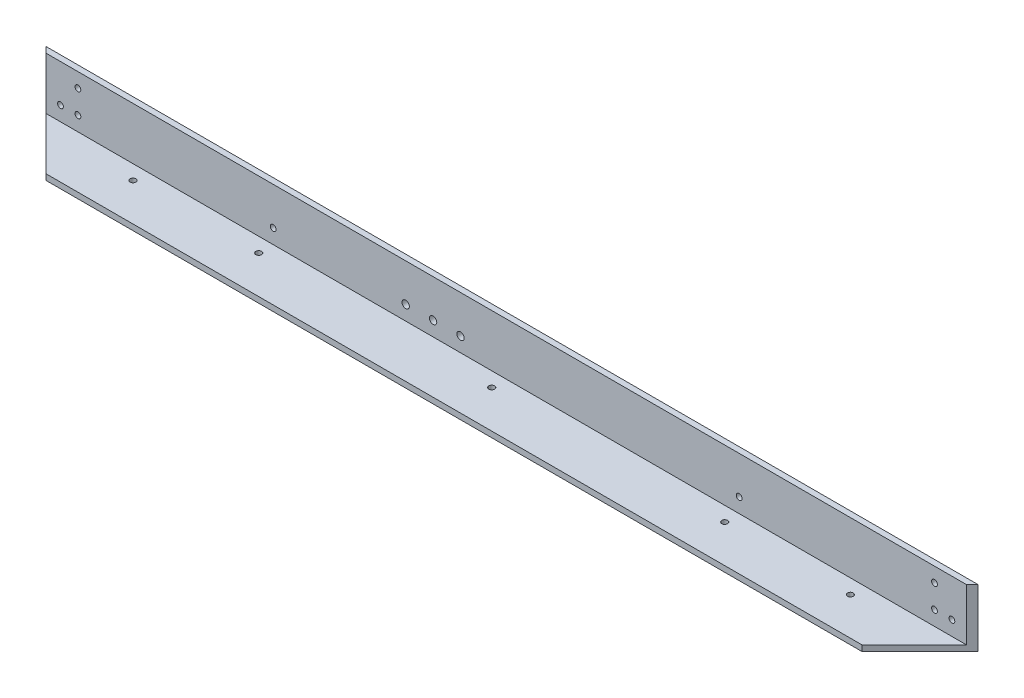
ISO-10303-21;
HEADER;
FILE_DESCRIPTION(('STEP AP214'),'2;1');
FILE_NAME('part.step','',(''),(''),'','','');
FILE_SCHEMA(('AUTOMOTIVE_DESIGN { 1 0 10303 214 1 1 1 1 }'));
ENDSEC;
DATA;
#1=APPLICATION_CONTEXT('core data for automotive mechanical design processes');
#2=APPLICATION_PROTOCOL_DEFINITION('international standard','automotive_design',2000,#1);
#3=PRODUCT_CONTEXT('',#1,'mechanical');
#4=PRODUCT('Part','Part','',(#3));
#5=PRODUCT_RELATED_PRODUCT_CATEGORY('part','',(#4));
#6=PRODUCT_DEFINITION_FORMATION('','',#4);
#7=PRODUCT_DEFINITION_CONTEXT('part definition',#1,'design');
#8=PRODUCT_DEFINITION('design','',#6,#7);
#9=PRODUCT_DEFINITION_SHAPE('','',#8);
#10=(LENGTH_UNIT() NAMED_UNIT(*) SI_UNIT(.MILLI.,.METRE.));
#11=(NAMED_UNIT(*) PLANE_ANGLE_UNIT() SI_UNIT($,.RADIAN.));
#12=(NAMED_UNIT(*) SI_UNIT($,.STERADIAN.) SOLID_ANGLE_UNIT());
#13=UNCERTAINTY_MEASURE_WITH_UNIT(LENGTH_MEASURE(1.E-05),#10,'distance_accuracy_value','');
#14=(GEOMETRIC_REPRESENTATION_CONTEXT(3) GLOBAL_UNCERTAINTY_ASSIGNED_CONTEXT((#13)) GLOBAL_UNIT_ASSIGNED_CONTEXT((#10,
#11,#12)) REPRESENTATION_CONTEXT('',''));
#15=CARTESIAN_POINT('',(0.,0.,0.));
#16=DIRECTION('',(0.,0.,1.));
#17=DIRECTION('',(1.,0.,0.));
#18=AXIS2_PLACEMENT_3D('',#15,#16,#17);
#19=CARTESIAN_POINT('',(510.,31.75,0.));
#20=DIRECTION('',(0.,0.,1.));
#21=DIRECTION('',(0.,-1.,0.));
#22=AXIS2_PLACEMENT_3D('',#19,#20,#21);
#23=PLANE('',#22);
#24=CARTESIAN_POINT('',(498.8875,11.1125,0.));
#25=DIRECTION('',(0.,0.,1.));
#26=DIRECTION('',(1.,0.,0.));
#27=AXIS2_PLACEMENT_3D('',#24,#25,#26);
#28=CIRCLE('',#27,1.58749999999999);
#29=CARTESIAN_POINT('',(500.475,11.1125,0.));
#30=VERTEX_POINT('',#29);
#31=EDGE_CURVE('E291',#30,#30,#28,.T.);
#32=ORIENTED_EDGE('',*,*,#31,.T.);
#33=EDGE_LOOP('',(#32));
#34=FACE_BOUND('',#33,.T.);
#35=CARTESIAN_POINT('',(200.,11.1125,0.));
#36=DIRECTION('',(0.,0.,1.));
#37=DIRECTION('',(1.,0.,0.));
#38=AXIS2_PLACEMENT_3D('',#35,#36,#37);
#39=CIRCLE('',#38,2.);
#40=CARTESIAN_POINT('',(202.,11.1125,0.));
#41=VERTEX_POINT('',#40);
#42=EDGE_CURVE('E281',#41,#41,#39,.T.);
#43=ORIENTED_EDGE('',*,*,#42,.T.);
#44=EDGE_LOOP('',(#43));
#45=FACE_BOUND('',#44,.T.);
#46=CARTESIAN_POINT('',(215.,11.1125,0.));
#47=DIRECTION('',(0.,0.,1.));
#48=DIRECTION('',(1.,0.,0.));
#49=AXIS2_PLACEMENT_3D('',#46,#47,#48);
#50=CIRCLE('',#49,2.);
#51=CARTESIAN_POINT('',(217.,11.1125,0.));
#52=VERTEX_POINT('',#51);
#53=EDGE_CURVE('E282',#52,#52,#50,.T.);
#54=ORIENTED_EDGE('',*,*,#53,.T.);
#55=EDGE_LOOP('',(#54));
#56=FACE_BOUND('',#55,.T.);
#57=CARTESIAN_POINT('',(230.,11.1125,0.));
#58=DIRECTION('',(0.,0.,1.));
#59=DIRECTION('',(1.,0.,0.));
#60=AXIS2_PLACEMENT_3D('',#57,#58,#59);
#61=CIRCLE('',#60,2.);
#62=CARTESIAN_POINT('',(232.,11.1125,0.));
#63=VERTEX_POINT('',#62);
#64=EDGE_CURVE('E265',#63,#63,#61,.T.);
#65=ORIENTED_EDGE('',*,*,#64,.T.);
#66=EDGE_LOOP('',(#65));
#67=FACE_BOUND('',#66,.T.);
#68=CARTESIAN_POINT('',(20.6375,23.8125,0.));
#69=DIRECTION('',(0.,0.,1.));
#70=DIRECTION('',(1.,0.,0.));
#71=AXIS2_PLACEMENT_3D('',#68,#69,#70);
#72=CIRCLE('',#71,1.5875);
#73=CARTESIAN_POINT('',(22.225,23.8125,0.));
#74=VERTEX_POINT('',#73);
#75=EDGE_CURVE('E314',#74,#74,#72,.T.);
#76=ORIENTED_EDGE('',*,*,#75,.T.);
#77=EDGE_LOOP('',(#76));
#78=FACE_BOUND('',#77,.T.);
#79=CARTESIAN_POINT('',(11.1125,11.1125,0.));
#80=DIRECTION('',(0.,0.,1.));
#81=DIRECTION('',(1.,0.,0.));
#82=AXIS2_PLACEMENT_3D('',#79,#80,#81);
#83=CIRCLE('',#82,1.5875);
#84=CARTESIAN_POINT('',(12.7,11.1125,0.));
#85=VERTEX_POINT('',#84);
#86=EDGE_CURVE('E301',#85,#85,#83,.T.);
#87=ORIENTED_EDGE('',*,*,#86,.T.);
#88=EDGE_LOOP('',(#87));
#89=FACE_BOUND('',#88,.T.);
#90=CARTESIAN_POINT('',(20.6375,11.1125,0.));
#91=DIRECTION('',(0.,0.,1.));
#92=DIRECTION('',(1.,0.,0.));
#93=AXIS2_PLACEMENT_3D('',#90,#91,#92);
#94=CIRCLE('',#93,1.5875);
#95=CARTESIAN_POINT('',(22.225,11.1125,0.));
#96=VERTEX_POINT('',#95);
#97=EDGE_CURVE('E302',#96,#96,#94,.T.);
#98=ORIENTED_EDGE('',*,*,#97,.T.);
#99=EDGE_LOOP('',(#98));
#100=FACE_BOUND('',#99,.T.);
#101=CARTESIAN_POINT('',(489.3625,11.1125,0.));
#102=DIRECTION('',(0.,0.,1.));
#103=DIRECTION('',(1.,0.,0.));
#104=AXIS2_PLACEMENT_3D('',#101,#102,#103);
#105=CIRCLE('',#104,1.58750000000004);
#106=CARTESIAN_POINT('',(490.95,11.1125,0.));
#107=VERTEX_POINT('',#106);
#108=EDGE_CURVE('E290',#107,#107,#105,.T.);
#109=ORIENTED_EDGE('',*,*,#108,.T.);
#110=EDGE_LOOP('',(#109));
#111=FACE_BOUND('',#110,.T.);
#112=CARTESIAN_POINT('',(127.5,11.1125,0.));
#113=DIRECTION('',(0.,0.,1.));
#114=DIRECTION('',(1.,0.,0.));
#115=AXIS2_PLACEMENT_3D('',#112,#113,#114);
#116=CIRCLE('',#115,1.58749999999998);
#117=CARTESIAN_POINT('',(129.0875,11.1125,0.));
#118=VERTEX_POINT('',#117);
#119=EDGE_CURVE('E260',#118,#118,#116,.T.);
#120=ORIENTED_EDGE('',*,*,#119,.T.);
#121=EDGE_LOOP('',(#120));
#122=FACE_BOUND('',#121,.T.);
#123=CARTESIAN_POINT('',(382.5,11.1125,0.));
#124=DIRECTION('',(0.,0.,1.));
#125=DIRECTION('',(1.,0.,0.));
#126=AXIS2_PLACEMENT_3D('',#123,#124,#125);
#127=CIRCLE('',#126,1.58750000000004);
#128=CARTESIAN_POINT('',(384.0875,11.1125,0.));
#129=VERTEX_POINT('',#128);
#130=EDGE_CURVE('E275',#129,#129,#127,.T.);
#131=ORIENTED_EDGE('',*,*,#130,.T.);
#132=EDGE_LOOP('',(#131));
#133=FACE_BOUND('',#132,.T.);
#134=CARTESIAN_POINT('',(489.3625,23.8125,0.));
#135=DIRECTION('',(0.,0.,1.));
#136=DIRECTION('',(1.,0.,0.));
#137=AXIS2_PLACEMENT_3D('',#134,#135,#136);
#138=CIRCLE('',#137,1.58750000000004);
#139=CARTESIAN_POINT('',(490.95,23.8125,0.));
#140=VERTEX_POINT('',#139);
#141=EDGE_CURVE('E322',#140,#140,#138,.T.);
#142=ORIENTED_EDGE('',*,*,#141,.T.);
#143=EDGE_LOOP('',(#142));
#144=FACE_BOUND('',#143,.T.);
#145=DIRECTION('',(0.,1.,0.));
#146=VECTOR('',#145,1.);
#147=CARTESIAN_POINT('',(0.,31.75,0.));
#148=LINE('',#147,#146);
#149=CARTESIAN_POINT('',(0.,0.,0.));
#150=VERTEX_POINT('',#149);
#151=CARTESIAN_POINT('',(0.,31.75,0.));
#152=VERTEX_POINT('',#151);
#153=EDGE_CURVE('E109',#150,#152,#148,.T.);
#154=ORIENTED_EDGE('',*,*,#153,.T.);
#155=DIRECTION('',(-1.,0.,0.));
#156=VECTOR('',#155,1.);
#157=CARTESIAN_POINT('',(510.,31.75,0.));
#158=LINE('',#157,#156);
#159=CARTESIAN_POINT('',(510.,31.75,0.));
#160=VERTEX_POINT('',#159);
#161=EDGE_CURVE('E95',#160,#152,#158,.T.);
#162=ORIENTED_EDGE('',*,*,#161,.F.);
#163=DIRECTION('',(0.,1.,0.));
#164=VECTOR('',#163,1.);
#165=CARTESIAN_POINT('',(510.,31.75,0.));
#166=LINE('',#165,#164);
#167=CARTESIAN_POINT('',(510.,0.,0.));
#168=VERTEX_POINT('',#167);
#169=EDGE_CURVE('E107',#168,#160,#166,.T.);
#170=ORIENTED_EDGE('',*,*,#169,.F.);
#171=DIRECTION('',(-1.,0.,0.));
#172=VECTOR('',#171,1.);
#173=CARTESIAN_POINT('',(510.,0.,0.));
#174=LINE('',#173,#172);
#175=EDGE_CURVE('E116',#168,#150,#174,.T.);
#176=ORIENTED_EDGE('',*,*,#175,.T.);
#177=EDGE_LOOP('',(#154,#162,#170,#176));
#178=FACE_BOUND('',#177,.T.);
#179=ADVANCED_FACE('F40',(#34,#45,#56,#67,#78,#89,#100,#111,#122,#133,#144,#178),#23,.F.);
#180=CARTESIAN_POINT('',(510.,31.75,3.17499999999997));
#181=DIRECTION('',(0.,-1.,0.));
#182=DIRECTION('',(0.,0.,-1.));
#183=AXIS2_PLACEMENT_3D('',#180,#181,#182);
#184=PLANE('',#183);
#185=ORIENTED_EDGE('',*,*,#161,.T.);
#186=DIRECTION('',(0.707106781186546,0.,0.707106781186549));
#187=VECTOR('',#186,1.);
#188=CARTESIAN_POINT('',(31.75,31.75,31.75));
#189=LINE('',#188,#187);
#190=CARTESIAN_POINT('',(3.17500000000004,31.75,3.17499999999997));
#191=VERTEX_POINT('',#190);
#192=EDGE_CURVE('E63',#152,#191,#189,.T.);
#193=ORIENTED_EDGE('',*,*,#192,.T.);
#194=DIRECTION('',(-1.,0.,0.));
#195=VECTOR('',#194,1.);
#196=CARTESIAN_POINT('',(510.,31.75,3.17499999999997));
#197=LINE('',#196,#195);
#198=CARTESIAN_POINT('',(506.825,31.75,3.17499999999997));
#199=VERTEX_POINT('',#198);
#200=EDGE_CURVE('E97',#199,#191,#197,.T.);
#201=ORIENTED_EDGE('',*,*,#200,.F.);
#202=DIRECTION('',(-0.707106781186548,0.,0.707106781186547));
#203=VECTOR('',#202,1.);
#204=CARTESIAN_POINT('',(510.,31.75,0.));
#205=LINE('',#204,#203);
#206=EDGE_CURVE('E92',#199,#160,#205,.F.);
#207=ORIENTED_EDGE('',*,*,#206,.T.);
#208=EDGE_LOOP('',(#185,#193,#201,#207));
#209=FACE_BOUND('',#208,.T.);
#210=ADVANCED_FACE('F94',(#209),#184,.F.);
#211=CARTESIAN_POINT('',(510.,3.17499999999996,3.175));
#212=DIRECTION('',(0.,0.,-1.));
#213=DIRECTION('',(0.,1.,0.));
#214=AXIS2_PLACEMENT_3D('',#211,#212,#213);
#215=PLANE('',#214);
#216=CARTESIAN_POINT('',(498.8875,11.1125,3.17500000000001));
#217=DIRECTION('',(0.,0.,1.));
#218=DIRECTION('',(1.,0.,0.));
#219=AXIS2_PLACEMENT_3D('',#216,#217,#218);
#220=CIRCLE('',#219,1.58749999999999);
#221=CARTESIAN_POINT('',(500.475,11.1125,3.17500000000001));
#222=VERTEX_POINT('',#221);
#223=EDGE_CURVE('E287',#222,#222,#220,.T.);
#224=ORIENTED_EDGE('',*,*,#223,.F.);
#225=EDGE_LOOP('',(#224));
#226=FACE_BOUND('',#225,.T.);
#227=CARTESIAN_POINT('',(200.,11.1125,3.17500000000001));
#228=DIRECTION('',(0.,0.,1.));
#229=DIRECTION('',(1.,0.,0.));
#230=AXIS2_PLACEMENT_3D('',#227,#228,#229);
#231=CIRCLE('',#230,2.);
#232=CARTESIAN_POINT('',(202.,11.1125,3.17500000000001));
#233=VERTEX_POINT('',#232);
#234=EDGE_CURVE('E293',#233,#233,#231,.T.);
#235=ORIENTED_EDGE('',*,*,#234,.F.);
#236=EDGE_LOOP('',(#235));
#237=FACE_BOUND('',#236,.T.);
#238=CARTESIAN_POINT('',(215.,11.1125,3.17500000000001));
#239=DIRECTION('',(0.,0.,1.));
#240=DIRECTION('',(1.,0.,0.));
#241=AXIS2_PLACEMENT_3D('',#238,#239,#240);
#242=CIRCLE('',#241,2.);
#243=CARTESIAN_POINT('',(217.,11.1125,3.17500000000001));
#244=VERTEX_POINT('',#243);
#245=EDGE_CURVE('E278',#244,#244,#242,.T.);
#246=ORIENTED_EDGE('',*,*,#245,.F.);
#247=EDGE_LOOP('',(#246));
#248=FACE_BOUND('',#247,.T.);
#249=CARTESIAN_POINT('',(230.,11.1125,3.17500000000001));
#250=DIRECTION('',(0.,0.,1.));
#251=DIRECTION('',(1.,0.,0.));
#252=AXIS2_PLACEMENT_3D('',#249,#250,#251);
#253=CIRCLE('',#252,2.);
#254=CARTESIAN_POINT('',(232.,11.1125,3.17500000000001));
#255=VERTEX_POINT('',#254);
#256=EDGE_CURVE('E268',#255,#255,#253,.T.);
#257=ORIENTED_EDGE('',*,*,#256,.F.);
#258=EDGE_LOOP('',(#257));
#259=FACE_BOUND('',#258,.T.);
#260=CARTESIAN_POINT('',(20.6375,23.8125,3.17500000000001));
#261=DIRECTION('',(0.,0.,1.));
#262=DIRECTION('',(1.,0.,0.));
#263=AXIS2_PLACEMENT_3D('',#260,#261,#262);
#264=CIRCLE('',#263,1.5875);
#265=CARTESIAN_POINT('',(22.225,23.8125,3.17500000000001));
#266=VERTEX_POINT('',#265);
#267=EDGE_CURVE('E310',#266,#266,#264,.T.);
#268=ORIENTED_EDGE('',*,*,#267,.F.);
#269=EDGE_LOOP('',(#268));
#270=FACE_BOUND('',#269,.T.);
#271=CARTESIAN_POINT('',(11.1125,11.1125,3.17500000000001));
#272=DIRECTION('',(0.,0.,1.));
#273=DIRECTION('',(1.,0.,0.));
#274=AXIS2_PLACEMENT_3D('',#271,#272,#273);
#275=CIRCLE('',#274,1.5875);
#276=CARTESIAN_POINT('',(12.7,11.1125,3.17500000000001));
#277=VERTEX_POINT('',#276);
#278=EDGE_CURVE('E317',#277,#277,#275,.T.);
#279=ORIENTED_EDGE('',*,*,#278,.F.);
#280=EDGE_LOOP('',(#279));
#281=FACE_BOUND('',#280,.T.);
#282=CARTESIAN_POINT('',(20.6375,11.1125,3.17500000000001));
#283=DIRECTION('',(0.,0.,1.));
#284=DIRECTION('',(1.,0.,0.));
#285=AXIS2_PLACEMENT_3D('',#282,#283,#284);
#286=CIRCLE('',#285,1.5875);
#287=CARTESIAN_POINT('',(22.225,11.1125,3.17500000000001));
#288=VERTEX_POINT('',#287);
#289=EDGE_CURVE('E298',#288,#288,#286,.T.);
#290=ORIENTED_EDGE('',*,*,#289,.F.);
#291=EDGE_LOOP('',(#290));
#292=FACE_BOUND('',#291,.T.);
#293=CARTESIAN_POINT('',(489.3625,11.1125,3.17500000000001));
#294=DIRECTION('',(0.,0.,1.));
#295=DIRECTION('',(1.,0.,0.));
#296=AXIS2_PLACEMENT_3D('',#293,#294,#295);
#297=CIRCLE('',#296,1.58750000000004);
#298=CARTESIAN_POINT('',(490.95,11.1125,3.17500000000001));
#299=VERTEX_POINT('',#298);
#300=EDGE_CURVE('E305',#299,#299,#297,.T.);
#301=ORIENTED_EDGE('',*,*,#300,.F.);
#302=EDGE_LOOP('',(#301));
#303=FACE_BOUND('',#302,.T.);
#304=CARTESIAN_POINT('',(127.5,11.1125,3.17500000000001));
#305=DIRECTION('',(0.,0.,1.));
#306=DIRECTION('',(1.,0.,0.));
#307=AXIS2_PLACEMENT_3D('',#304,#305,#306);
#308=CIRCLE('',#307,1.58749999999998);
#309=CARTESIAN_POINT('',(129.0875,11.1125,3.17500000000001));
#310=VERTEX_POINT('',#309);
#311=EDGE_CURVE('E263',#310,#310,#308,.T.);
#312=ORIENTED_EDGE('',*,*,#311,.F.);
#313=EDGE_LOOP('',(#312));
#314=FACE_BOUND('',#313,.T.);
#315=CARTESIAN_POINT('',(382.5,11.1125,3.17500000000001));
#316=DIRECTION('',(0.,0.,1.));
#317=DIRECTION('',(1.,0.,0.));
#318=AXIS2_PLACEMENT_3D('',#315,#316,#317);
#319=CIRCLE('',#318,1.58750000000004);
#320=CARTESIAN_POINT('',(384.0875,11.1125,3.17500000000001));
#321=VERTEX_POINT('',#320);
#322=EDGE_CURVE('E270',#321,#321,#319,.T.);
#323=ORIENTED_EDGE('',*,*,#322,.F.);
#324=EDGE_LOOP('',(#323));
#325=FACE_BOUND('',#324,.T.);
#326=CARTESIAN_POINT('',(489.3625,23.8125,3.17500000000001));
#327=DIRECTION('',(0.,0.,1.));
#328=DIRECTION('',(1.,0.,0.));
#329=AXIS2_PLACEMENT_3D('',#326,#327,#328);
#330=CIRCLE('',#329,1.58750000000004);
#331=CARTESIAN_POINT('',(490.95,23.8125,3.17500000000001));
#332=VERTEX_POINT('',#331);
#333=EDGE_CURVE('E313',#332,#332,#330,.T.);
#334=ORIENTED_EDGE('',*,*,#333,.F.);
#335=EDGE_LOOP('',(#334));
#336=FACE_BOUND('',#335,.T.);
#337=ORIENTED_EDGE('',*,*,#200,.T.);
#338=DIRECTION('',(0.,-1.,0.));
#339=VECTOR('',#338,1.);
#340=CARTESIAN_POINT('',(3.17500000000014,0.,3.17500000000001));
#341=LINE('',#340,#339);
#342=CARTESIAN_POINT('',(3.17500000000004,3.17499999999996,3.175));
#343=VERTEX_POINT('',#342);
#344=EDGE_CURVE('E49',#191,#343,#341,.T.);
#345=ORIENTED_EDGE('',*,*,#344,.T.);
#346=DIRECTION('',(-1.,0.,0.));
#347=VECTOR('',#346,1.);
#348=CARTESIAN_POINT('',(510.,3.17499999999996,3.175));
#349=LINE('',#348,#347);
#350=CARTESIAN_POINT('',(506.825,3.17499999999996,3.175));
#351=VERTEX_POINT('',#350);
#352=EDGE_CURVE('E131',#351,#343,#349,.T.);
#353=ORIENTED_EDGE('',*,*,#352,.F.);
#354=DIRECTION('',(0.,-1.,0.));
#355=VECTOR('',#354,1.);
#356=CARTESIAN_POINT('',(506.825,0.,3.17500000000001));
#357=LINE('',#356,#355);
#358=EDGE_CURVE('E102',#351,#199,#357,.F.);
#359=ORIENTED_EDGE('',*,*,#358,.T.);
#360=EDGE_LOOP('',(#337,#345,#353,#359));
#361=FACE_BOUND('',#360,.T.);
#362=ADVANCED_FACE('F155',(#226,#237,#248,#259,#270,#281,#292,#303,#314,#325,#336,#361),#215,.F.);
#363=CARTESIAN_POINT('',(510.,3.17499999999996,31.75));
#364=DIRECTION('',(0.,-1.,0.));
#365=DIRECTION('',(0.,0.,-1.));
#366=AXIS2_PLACEMENT_3D('',#363,#364,#365);
#367=PLANE('',#366);
#368=CARTESIAN_POINT('',(255.,3.17499999999996,11.1125));
#369=DIRECTION('',(0.,1.,0.));
#370=DIRECTION('',(0.,0.,1.));
#371=AXIS2_PLACEMENT_3D('',#368,#369,#370);
#372=CIRCLE('',#371,1.58750000000004);
#373=CARTESIAN_POINT('',(255.,3.17499999999996,12.7));
#374=VERTEX_POINT('',#373);
#375=EDGE_CURVE('E340',#374,#374,#372,.T.);
#376=ORIENTED_EDGE('',*,*,#375,.F.);
#377=EDGE_LOOP('',(#376));
#378=FACE_BOUND('',#377,.T.);
#379=CARTESIAN_POINT('',(382.5,3.17499999999996,11.1125));
#380=DIRECTION('',(0.,1.,0.));
#381=DIRECTION('',(0.,0.,1.));
#382=AXIS2_PLACEMENT_3D('',#379,#380,#381);
#383=CIRCLE('',#382,1.58750000000004);
#384=CARTESIAN_POINT('',(382.5,3.17499999999996,12.7));
#385=VERTEX_POINT('',#384);
#386=EDGE_CURVE('E345',#385,#385,#383,.T.);
#387=ORIENTED_EDGE('',*,*,#386,.F.);
#388=EDGE_LOOP('',(#387));
#389=FACE_BOUND('',#388,.T.);
#390=CARTESIAN_POINT('',(451.2625,3.17499999999996,11.1125));
#391=DIRECTION('',(0.,1.,0.));
#392=DIRECTION('',(0.,0.,1.));
#393=AXIS2_PLACEMENT_3D('',#390,#391,#392);
#394=CIRCLE('',#393,1.58750000000004);
#395=CARTESIAN_POINT('',(451.2625,3.17499999999996,12.7));
#396=VERTEX_POINT('',#395);
#397=EDGE_CURVE('E328',#396,#396,#394,.T.);
#398=ORIENTED_EDGE('',*,*,#397,.F.);
#399=EDGE_LOOP('',(#398));
#400=FACE_BOUND('',#399,.T.);
#401=CARTESIAN_POINT('',(58.7375,3.17499999999996,11.1125));
#402=DIRECTION('',(0.,1.,0.));
#403=DIRECTION('',(0.,0.,1.));
#404=AXIS2_PLACEMENT_3D('',#401,#402,#403);
#405=CIRCLE('',#404,1.5875);
#406=CARTESIAN_POINT('',(58.7375,3.17499999999996,12.7));
#407=VERTEX_POINT('',#406);
#408=EDGE_CURVE('E335',#407,#407,#405,.T.);
#409=ORIENTED_EDGE('',*,*,#408,.F.);
#410=EDGE_LOOP('',(#409));
#411=FACE_BOUND('',#410,.T.);
#412=CARTESIAN_POINT('',(127.5,3.17499999999996,11.1125));
#413=DIRECTION('',(0.,1.,0.));
#414=DIRECTION('',(0.,0.,1.));
#415=AXIS2_PLACEMENT_3D('',#412,#413,#414);
#416=CIRCLE('',#415,1.58749999999998);
#417=CARTESIAN_POINT('',(127.5,3.17499999999996,12.7));
#418=VERTEX_POINT('',#417);
#419=EDGE_CURVE('E123',#418,#418,#416,.T.);
#420=ORIENTED_EDGE('',*,*,#419,.F.);
#421=EDGE_LOOP('',(#420));
#422=FACE_BOUND('',#421,.T.);
#423=ORIENTED_EDGE('',*,*,#352,.T.);
#424=DIRECTION('',(0.707106781186546,0.,0.707106781186549));
#425=VECTOR('',#424,1.);
#426=CARTESIAN_POINT('',(31.75,3.17499999999996,31.75));
#427=LINE('',#426,#425);
#428=CARTESIAN_POINT('',(31.75,3.17499999999996,31.75));
#429=VERTEX_POINT('',#428);
#430=EDGE_CURVE('E11',#343,#429,#427,.T.);
#431=ORIENTED_EDGE('',*,*,#430,.T.);
#432=DIRECTION('',(-1.,0.,0.));
#433=VECTOR('',#432,1.);
#434=CARTESIAN_POINT('',(510.,3.17499999999996,31.75));
#435=LINE('',#434,#433);
#436=CARTESIAN_POINT('',(478.25,3.17499999999996,31.75));
#437=VERTEX_POINT('',#436);
#438=EDGE_CURVE('E128',#437,#429,#435,.T.);
#439=ORIENTED_EDGE('',*,*,#438,.F.);
#440=DIRECTION('',(-0.707106781186548,0.,0.707106781186547));
#441=VECTOR('',#440,1.);
#442=CARTESIAN_POINT('',(510.,3.17499999999996,0.));
#443=LINE('',#442,#441);
#444=EDGE_CURVE('E137',#437,#351,#443,.F.);
#445=ORIENTED_EDGE('',*,*,#444,.T.);
#446=EDGE_LOOP('',(#423,#431,#439,#445));
#447=FACE_BOUND('',#446,.T.);
#448=ADVANCED_FACE('F152',(#378,#389,#400,#411,#422,#447),#367,.F.);
#449=CARTESIAN_POINT('',(510.,0.,31.75));
#450=DIRECTION('',(0.,0.,-1.));
#451=DIRECTION('',(-1.,0.,0.));
#452=AXIS2_PLACEMENT_3D('',#449,#450,#451);
#453=PLANE('',#452);
#454=ORIENTED_EDGE('',*,*,#438,.T.);
#455=DIRECTION('',(0.,-1.,0.));
#456=VECTOR('',#455,1.);
#457=CARTESIAN_POINT('',(31.75,0.,31.75));
#458=LINE('',#457,#456);
#459=CARTESIAN_POINT('',(31.75,0.,31.75));
#460=VERTEX_POINT('',#459);
#461=EDGE_CURVE('E101',#429,#460,#458,.T.);
#462=ORIENTED_EDGE('',*,*,#461,.T.);
#463=DIRECTION('',(-1.,0.,0.));
#464=VECTOR('',#463,1.);
#465=CARTESIAN_POINT('',(510.,0.,31.75));
#466=LINE('',#465,#464);
#467=CARTESIAN_POINT('',(478.25,0.,31.75));
#468=VERTEX_POINT('',#467);
#469=EDGE_CURVE('E118',#468,#460,#466,.T.);
#470=ORIENTED_EDGE('',*,*,#469,.F.);
#471=DIRECTION('',(0.,1.,0.));
#472=VECTOR('',#471,1.);
#473=CARTESIAN_POINT('',(478.25,0.,31.75));
#474=LINE('',#473,#472);
#475=EDGE_CURVE('E135',#468,#437,#474,.T.);
#476=ORIENTED_EDGE('',*,*,#475,.T.);
#477=EDGE_LOOP('',(#454,#462,#470,#476));
#478=FACE_BOUND('',#477,.T.);
#479=ADVANCED_FACE('F154',(#478),#453,.F.);
#480=CARTESIAN_POINT('',(510.,0.,0.));
#481=DIRECTION('',(0.,1.,0.));
#482=DIRECTION('',(0.,0.,1.));
#483=AXIS2_PLACEMENT_3D('',#480,#481,#482);
#484=PLANE('',#483);
#485=CARTESIAN_POINT('',(255.,0.,11.1125));
#486=DIRECTION('',(0.,1.,0.));
#487=DIRECTION('',(0.,0.,1.));
#488=AXIS2_PLACEMENT_3D('',#485,#486,#487);
#489=CIRCLE('',#488,1.58750000000004);
#490=CARTESIAN_POINT('',(255.,0.,12.7));
#491=VERTEX_POINT('',#490);
#492=EDGE_CURVE('E343',#491,#491,#489,.T.);
#493=ORIENTED_EDGE('',*,*,#492,.T.);
#494=EDGE_LOOP('',(#493));
#495=FACE_BOUND('',#494,.T.);
#496=CARTESIAN_POINT('',(382.5,0.,11.1125));
#497=DIRECTION('',(0.,1.,0.));
#498=DIRECTION('',(0.,0.,1.));
#499=AXIS2_PLACEMENT_3D('',#496,#497,#498);
#500=CIRCLE('',#499,1.58750000000004);
#501=CARTESIAN_POINT('',(382.5,0.,12.7));
#502=VERTEX_POINT('',#501);
#503=EDGE_CURVE('E331',#502,#502,#500,.T.);
#504=ORIENTED_EDGE('',*,*,#503,.T.);
#505=EDGE_LOOP('',(#504));
#506=FACE_BOUND('',#505,.T.);
#507=CARTESIAN_POINT('',(451.2625,0.,11.1125));
#508=DIRECTION('',(0.,1.,0.));
#509=DIRECTION('',(0.,0.,1.));
#510=AXIS2_PLACEMENT_3D('',#507,#508,#509);
#511=CIRCLE('',#510,1.58750000000004);
#512=CARTESIAN_POINT('',(451.2625,0.,12.7));
#513=VERTEX_POINT('',#512);
#514=EDGE_CURVE('E332',#513,#513,#511,.T.);
#515=ORIENTED_EDGE('',*,*,#514,.T.);
#516=EDGE_LOOP('',(#515));
#517=FACE_BOUND('',#516,.T.);
#518=CARTESIAN_POINT('',(58.7375,0.,11.1125));
#519=DIRECTION('',(0.,1.,0.));
#520=DIRECTION('',(0.,0.,1.));
#521=AXIS2_PLACEMENT_3D('',#518,#519,#520);
#522=CIRCLE('',#521,1.5875);
#523=CARTESIAN_POINT('',(58.7375,0.,12.7));
#524=VERTEX_POINT('',#523);
#525=EDGE_CURVE('E325',#524,#524,#522,.T.);
#526=ORIENTED_EDGE('',*,*,#525,.T.);
#527=EDGE_LOOP('',(#526));
#528=FACE_BOUND('',#527,.T.);
#529=CARTESIAN_POINT('',(127.5,0.,11.1125));
#530=DIRECTION('',(0.,1.,0.));
#531=DIRECTION('',(0.,0.,1.));
#532=AXIS2_PLACEMENT_3D('',#529,#530,#531);
#533=CIRCLE('',#532,1.58749999999998);
#534=CARTESIAN_POINT('',(127.5,0.,12.7));
#535=VERTEX_POINT('',#534);
#536=EDGE_CURVE('E120',#535,#535,#533,.T.);
#537=ORIENTED_EDGE('',*,*,#536,.T.);
#538=EDGE_LOOP('',(#537));
#539=FACE_BOUND('',#538,.T.);
#540=ORIENTED_EDGE('',*,*,#469,.T.);
#541=DIRECTION('',(-0.707106781186546,0.,-0.707106781186549));
#542=VECTOR('',#541,1.);
#543=CARTESIAN_POINT('',(31.75,0.,31.75));
#544=LINE('',#543,#542);
#545=EDGE_CURVE('E142',#460,#150,#544,.T.);
#546=ORIENTED_EDGE('',*,*,#545,.T.);
#547=ORIENTED_EDGE('',*,*,#175,.F.);
#548=DIRECTION('',(0.707106781186548,0.,-0.707106781186547));
#549=VECTOR('',#548,1.);
#550=CARTESIAN_POINT('',(510.,0.,0.));
#551=LINE('',#550,#549);
#552=EDGE_CURVE('E110',#168,#468,#551,.F.);
#553=ORIENTED_EDGE('',*,*,#552,.T.);
#554=EDGE_LOOP('',(#540,#546,#547,#553));
#555=FACE_BOUND('',#554,.T.);
#556=ADVANCED_FACE('F145',(#495,#506,#517,#528,#539,#555),#484,.F.);
#557=CARTESIAN_POINT('',(510.,0.,0.));
#558=DIRECTION('',(-0.707106781186547,0.,-0.707106781186548));
#559=DIRECTION('',(0.,-1.,0.));
#560=AXIS2_PLACEMENT_3D('',#557,#558,#559);
#561=PLANE('',#560);
#562=ORIENTED_EDGE('',*,*,#444,.F.);
#563=ORIENTED_EDGE('',*,*,#475,.F.);
#564=ORIENTED_EDGE('',*,*,#552,.F.);
#565=ORIENTED_EDGE('',*,*,#169,.T.);
#566=ORIENTED_EDGE('',*,*,#206,.F.);
#567=ORIENTED_EDGE('',*,*,#358,.F.);
#568=EDGE_LOOP('',(#562,#563,#564,#565,#566,#567));
#569=FACE_BOUND('',#568,.T.);
#570=ADVANCED_FACE('F113',(#569),#561,.F.);
#571=CARTESIAN_POINT('',(31.75,0.,31.75));
#572=DIRECTION('',(-0.707106781186549,0.,0.707106781186546));
#573=DIRECTION('',(0.,1.,0.));
#574=AXIS2_PLACEMENT_3D('',#571,#572,#573);
#575=PLANE('',#574);
#576=ORIENTED_EDGE('',*,*,#192,.F.);
#577=ORIENTED_EDGE('',*,*,#153,.F.);
#578=ORIENTED_EDGE('',*,*,#545,.F.);
#579=ORIENTED_EDGE('',*,*,#461,.F.);
#580=ORIENTED_EDGE('',*,*,#430,.F.);
#581=ORIENTED_EDGE('',*,*,#344,.F.);
#582=EDGE_LOOP('',(#576,#577,#578,#579,#580,#581));
#583=FACE_BOUND('',#582,.T.);
#584=ADVANCED_FACE('F43',(#583),#575,.T.);
#585=CARTESIAN_POINT('',(127.5,0.,11.1125));
#586=DIRECTION('',(0.,1.,0.));
#587=DIRECTION('',(0.,0.,1.));
#588=AXIS2_PLACEMENT_3D('',#585,#586,#587);
#589=CYLINDRICAL_SURFACE('',#588,1.58749999999998);
#590=ORIENTED_EDGE('',*,*,#536,.F.);
#591=EDGE_LOOP('',(#590));
#592=FACE_BOUND('',#591,.T.);
#593=ORIENTED_EDGE('',*,*,#419,.T.);
#594=EDGE_LOOP('',(#593));
#595=FACE_BOUND('',#594,.T.);
#596=ADVANCED_FACE('F183',(#592,#595),#589,.F.);
#597=CARTESIAN_POINT('',(58.7375,0.,11.1125));
#598=DIRECTION('',(0.,1.,0.));
#599=DIRECTION('',(0.,0.,1.));
#600=AXIS2_PLACEMENT_3D('',#597,#598,#599);
#601=CYLINDRICAL_SURFACE('',#600,1.5875);
#602=ORIENTED_EDGE('',*,*,#525,.F.);
#603=EDGE_LOOP('',(#602));
#604=FACE_BOUND('',#603,.T.);
#605=ORIENTED_EDGE('',*,*,#408,.T.);
#606=EDGE_LOOP('',(#605));
#607=FACE_BOUND('',#606,.T.);
#608=ADVANCED_FACE('F195',(#604,#607),#601,.F.);
#609=CARTESIAN_POINT('',(451.2625,0.,11.1125));
#610=DIRECTION('',(0.,1.,0.));
#611=DIRECTION('',(0.,0.,1.));
#612=AXIS2_PLACEMENT_3D('',#609,#610,#611);
#613=CYLINDRICAL_SURFACE('',#612,1.58750000000004);
#614=ORIENTED_EDGE('',*,*,#514,.F.);
#615=EDGE_LOOP('',(#614));
#616=FACE_BOUND('',#615,.T.);
#617=ORIENTED_EDGE('',*,*,#397,.T.);
#618=EDGE_LOOP('',(#617));
#619=FACE_BOUND('',#618,.T.);
#620=ADVANCED_FACE('F201',(#616,#619),#613,.F.);
#621=CARTESIAN_POINT('',(382.5,0.,11.1125));
#622=DIRECTION('',(0.,1.,0.));
#623=DIRECTION('',(0.,0.,1.));
#624=AXIS2_PLACEMENT_3D('',#621,#622,#623);
#625=CYLINDRICAL_SURFACE('',#624,1.58750000000004);
#626=ORIENTED_EDGE('',*,*,#503,.F.);
#627=EDGE_LOOP('',(#626));
#628=FACE_BOUND('',#627,.T.);
#629=ORIENTED_EDGE('',*,*,#386,.T.);
#630=EDGE_LOOP('',(#629));
#631=FACE_BOUND('',#630,.T.);
#632=ADVANCED_FACE('F197',(#628,#631),#625,.F.);
#633=CARTESIAN_POINT('',(255.,0.,11.1125));
#634=DIRECTION('',(0.,1.,0.));
#635=DIRECTION('',(0.,0.,1.));
#636=AXIS2_PLACEMENT_3D('',#633,#634,#635);
#637=CYLINDRICAL_SURFACE('',#636,1.58750000000004);
#638=ORIENTED_EDGE('',*,*,#492,.F.);
#639=EDGE_LOOP('',(#638));
#640=FACE_BOUND('',#639,.T.);
#641=ORIENTED_EDGE('',*,*,#375,.T.);
#642=EDGE_LOOP('',(#641));
#643=FACE_BOUND('',#642,.T.);
#644=ADVANCED_FACE('F200',(#640,#643),#637,.F.);
#645=CARTESIAN_POINT('',(489.3625,23.8125,0.));
#646=DIRECTION('',(0.,0.,1.));
#647=DIRECTION('',(1.,0.,0.));
#648=AXIS2_PLACEMENT_3D('',#645,#646,#647);
#649=CYLINDRICAL_SURFACE('',#648,1.58750000000004);
#650=ORIENTED_EDGE('',*,*,#141,.F.);
#651=EDGE_LOOP('',(#650));
#652=FACE_BOUND('',#651,.T.);
#653=ORIENTED_EDGE('',*,*,#333,.T.);
#654=EDGE_LOOP('',(#653));
#655=FACE_BOUND('',#654,.T.);
#656=ADVANCED_FACE('F205',(#652,#655),#649,.F.);
#657=CARTESIAN_POINT('',(382.5,11.1125,0.));
#658=DIRECTION('',(0.,0.,1.));
#659=DIRECTION('',(1.,0.,0.));
#660=AXIS2_PLACEMENT_3D('',#657,#658,#659);
#661=CYLINDRICAL_SURFACE('',#660,1.58750000000004);
#662=ORIENTED_EDGE('',*,*,#130,.F.);
#663=EDGE_LOOP('',(#662));
#664=FACE_BOUND('',#663,.T.);
#665=ORIENTED_EDGE('',*,*,#322,.T.);
#666=EDGE_LOOP('',(#665));
#667=FACE_BOUND('',#666,.T.);
#668=ADVANCED_FACE('F215',(#664,#667),#661,.F.);
#669=CARTESIAN_POINT('',(127.5,11.1125,0.));
#670=DIRECTION('',(0.,0.,1.));
#671=DIRECTION('',(1.,0.,0.));
#672=AXIS2_PLACEMENT_3D('',#669,#670,#671);
#673=CYLINDRICAL_SURFACE('',#672,1.58749999999998);
#674=ORIENTED_EDGE('',*,*,#119,.F.);
#675=EDGE_LOOP('',(#674));
#676=FACE_BOUND('',#675,.T.);
#677=ORIENTED_EDGE('',*,*,#311,.T.);
#678=EDGE_LOOP('',(#677));
#679=FACE_BOUND('',#678,.T.);
#680=ADVANCED_FACE('F230',(#676,#679),#673,.F.);
#681=CARTESIAN_POINT('',(489.3625,11.1125,0.));
#682=DIRECTION('',(0.,0.,1.));
#683=DIRECTION('',(1.,0.,0.));
#684=AXIS2_PLACEMENT_3D('',#681,#682,#683);
#685=CYLINDRICAL_SURFACE('',#684,1.58750000000004);
#686=ORIENTED_EDGE('',*,*,#108,.F.);
#687=EDGE_LOOP('',(#686));
#688=FACE_BOUND('',#687,.T.);
#689=ORIENTED_EDGE('',*,*,#300,.T.);
#690=EDGE_LOOP('',(#689));
#691=FACE_BOUND('',#690,.T.);
#692=ADVANCED_FACE('F227',(#688,#691),#685,.F.);
#693=CARTESIAN_POINT('',(20.6375,11.1125,0.));
#694=DIRECTION('',(0.,0.,1.));
#695=DIRECTION('',(1.,0.,0.));
#696=AXIS2_PLACEMENT_3D('',#693,#694,#695);
#697=CYLINDRICAL_SURFACE('',#696,1.5875);
#698=ORIENTED_EDGE('',*,*,#97,.F.);
#699=EDGE_LOOP('',(#698));
#700=FACE_BOUND('',#699,.T.);
#701=ORIENTED_EDGE('',*,*,#289,.T.);
#702=EDGE_LOOP('',(#701));
#703=FACE_BOUND('',#702,.T.);
#704=ADVANCED_FACE('F221',(#700,#703),#697,.F.);
#705=CARTESIAN_POINT('',(11.1125,11.1125,0.));
#706=DIRECTION('',(0.,0.,1.));
#707=DIRECTION('',(1.,0.,0.));
#708=AXIS2_PLACEMENT_3D('',#705,#706,#707);
#709=CYLINDRICAL_SURFACE('',#708,1.5875);
#710=ORIENTED_EDGE('',*,*,#86,.F.);
#711=EDGE_LOOP('',(#710));
#712=FACE_BOUND('',#711,.T.);
#713=ORIENTED_EDGE('',*,*,#278,.T.);
#714=EDGE_LOOP('',(#713));
#715=FACE_BOUND('',#714,.T.);
#716=ADVANCED_FACE('F217',(#712,#715),#709,.F.);
#717=CARTESIAN_POINT('',(20.6375,23.8125,0.));
#718=DIRECTION('',(0.,0.,1.));
#719=DIRECTION('',(1.,0.,0.));
#720=AXIS2_PLACEMENT_3D('',#717,#718,#719);
#721=CYLINDRICAL_SURFACE('',#720,1.5875);
#722=ORIENTED_EDGE('',*,*,#75,.F.);
#723=EDGE_LOOP('',(#722));
#724=FACE_BOUND('',#723,.T.);
#725=ORIENTED_EDGE('',*,*,#267,.T.);
#726=EDGE_LOOP('',(#725));
#727=FACE_BOUND('',#726,.T.);
#728=ADVANCED_FACE('F220',(#724,#727),#721,.F.);
#729=CARTESIAN_POINT('',(230.,11.1125,0.));
#730=DIRECTION('',(0.,0.,1.));
#731=DIRECTION('',(1.,0.,0.));
#732=AXIS2_PLACEMENT_3D('',#729,#730,#731);
#733=CYLINDRICAL_SURFACE('',#732,2.);
#734=ORIENTED_EDGE('',*,*,#64,.F.);
#735=EDGE_LOOP('',(#734));
#736=FACE_BOUND('',#735,.T.);
#737=ORIENTED_EDGE('',*,*,#256,.T.);
#738=EDGE_LOOP('',(#737));
#739=FACE_BOUND('',#738,.T.);
#740=ADVANCED_FACE('F225',(#736,#739),#733,.F.);
#741=CARTESIAN_POINT('',(215.,11.1125,0.));
#742=DIRECTION('',(0.,0.,1.));
#743=DIRECTION('',(1.,0.,0.));
#744=AXIS2_PLACEMENT_3D('',#741,#742,#743);
#745=CYLINDRICAL_SURFACE('',#744,2.);
#746=ORIENTED_EDGE('',*,*,#53,.F.);
#747=EDGE_LOOP('',(#746));
#748=FACE_BOUND('',#747,.T.);
#749=ORIENTED_EDGE('',*,*,#245,.T.);
#750=EDGE_LOOP('',(#749));
#751=FACE_BOUND('',#750,.T.);
#752=ADVANCED_FACE('F239',(#748,#751),#745,.F.);
#753=CARTESIAN_POINT('',(200.,11.1125,0.));
#754=DIRECTION('',(0.,0.,1.));
#755=DIRECTION('',(1.,0.,0.));
#756=AXIS2_PLACEMENT_3D('',#753,#754,#755);
#757=CYLINDRICAL_SURFACE('',#756,2.);
#758=ORIENTED_EDGE('',*,*,#42,.F.);
#759=EDGE_LOOP('',(#758));
#760=FACE_BOUND('',#759,.T.);
#761=ORIENTED_EDGE('',*,*,#234,.T.);
#762=EDGE_LOOP('',(#761));
#763=FACE_BOUND('',#762,.T.);
#764=ADVANCED_FACE('F235',(#760,#763),#757,.F.);
#765=CARTESIAN_POINT('',(498.8875,11.1125,0.));
#766=DIRECTION('',(0.,0.,1.));
#767=DIRECTION('',(1.,0.,0.));
#768=AXIS2_PLACEMENT_3D('',#765,#766,#767);
#769=CYLINDRICAL_SURFACE('',#768,1.58749999999999);
#770=ORIENTED_EDGE('',*,*,#31,.F.);
#771=EDGE_LOOP('',(#770));
#772=FACE_BOUND('',#771,.T.);
#773=ORIENTED_EDGE('',*,*,#223,.T.);
#774=EDGE_LOOP('',(#773));
#775=FACE_BOUND('',#774,.T.);
#776=ADVANCED_FACE('F238',(#772,#775),#769,.F.);
#777=CLOSED_SHELL('',(#179,#210,#362,#448,#479,#556,#570,#584,#596,#608,#620,#632,#644,#656,
#668,#680,#692,#704,#716,#728,#740,#752,#764,#776));
#778=MANIFOLD_SOLID_BREP('B2',#777);
#779=ADVANCED_BREP_SHAPE_REPRESENTATION('',(#18,#778),#14);
#780=SHAPE_DEFINITION_REPRESENTATION(#9,#779);
ENDSEC;
END-ISO-10303-21;
